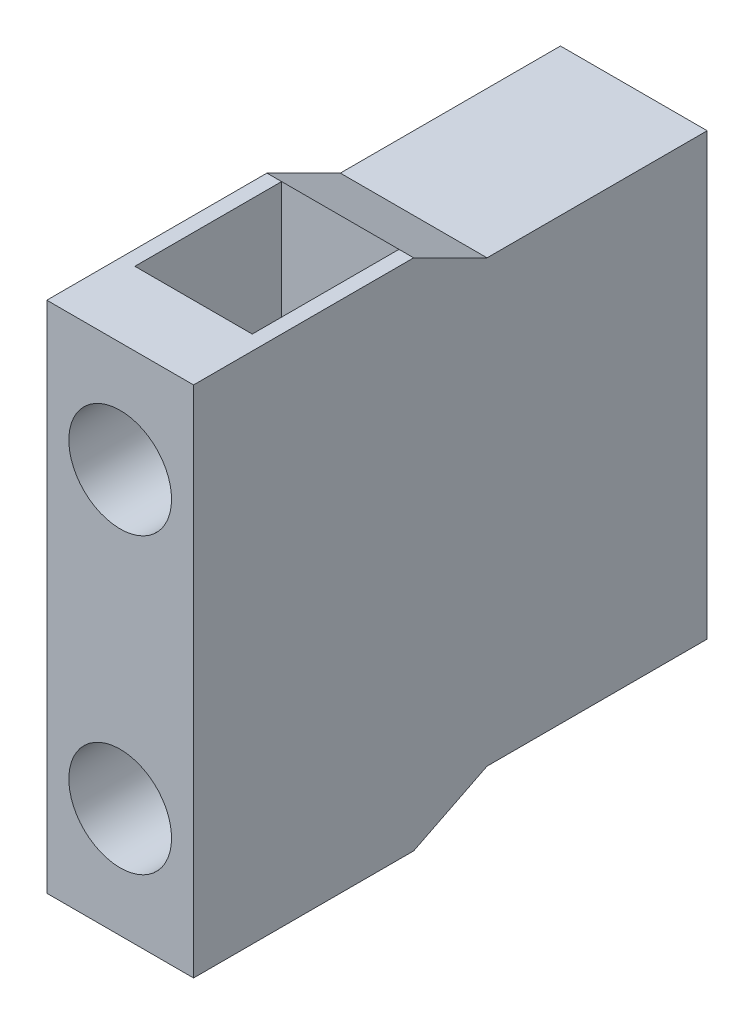
ISO-10303-21;
HEADER;
FILE_DESCRIPTION(('STEP AP214'),'2;1');
FILE_NAME('part.step','',(''),(''),'','','');
FILE_SCHEMA(('AUTOMOTIVE_DESIGN { 1 0 10303 214 1 1 1 1 }'));
ENDSEC;
DATA;
#1=APPLICATION_CONTEXT('core data for automotive mechanical design processes');
#2=APPLICATION_PROTOCOL_DEFINITION('international standard','automotive_design',2000,#1);
#3=PRODUCT_CONTEXT('',#1,'mechanical');
#4=PRODUCT('Part','Part','',(#3));
#5=PRODUCT_RELATED_PRODUCT_CATEGORY('part','',(#4));
#6=PRODUCT_DEFINITION_FORMATION('','',#4);
#7=PRODUCT_DEFINITION_CONTEXT('part definition',#1,'design');
#8=PRODUCT_DEFINITION('design','',#6,#7);
#9=PRODUCT_DEFINITION_SHAPE('','',#8);
#10=(LENGTH_UNIT() NAMED_UNIT(*) SI_UNIT(.MILLI.,.METRE.));
#11=(NAMED_UNIT(*) PLANE_ANGLE_UNIT() SI_UNIT($,.RADIAN.));
#12=(NAMED_UNIT(*) SI_UNIT($,.STERADIAN.) SOLID_ANGLE_UNIT());
#13=UNCERTAINTY_MEASURE_WITH_UNIT(LENGTH_MEASURE(1.E-05),#10,'distance_accuracy_value','');
#14=(GEOMETRIC_REPRESENTATION_CONTEXT(3) GLOBAL_UNCERTAINTY_ASSIGNED_CONTEXT((#13)) GLOBAL_UNIT_ASSIGNED_CONTEXT((#10,
#11,#12)) REPRESENTATION_CONTEXT('',''));
#15=CARTESIAN_POINT('',(0.,0.,0.));
#16=DIRECTION('',(0.,0.,1.));
#17=DIRECTION('',(1.,0.,0.));
#18=AXIS2_PLACEMENT_3D('',#15,#16,#17);
#19=CARTESIAN_POINT('',(9.,0.,-5.));
#20=DIRECTION('',(0.,0.,1.));
#21=DIRECTION('',(1.,0.,0.));
#22=AXIS2_PLACEMENT_3D('',#19,#20,#21);
#23=PLANE('',#22);
#24=CARTESIAN_POINT('',(5.,27.5,-5.));
#25=DIRECTION('',(0.,0.,1.));
#26=DIRECTION('',(1.,0.,0.));
#27=AXIS2_PLACEMENT_3D('',#24,#25,#26);
#28=CIRCLE('',#27,3.5);
#29=CARTESIAN_POINT('',(8.5,27.5,-5.));
#30=VERTEX_POINT('',#29);
#31=EDGE_CURVE('E178',#30,#30,#28,.F.);
#32=ORIENTED_EDGE('',*,*,#31,.F.);
#33=EDGE_LOOP('',(#32));
#34=FACE_BOUND('',#33,.T.);
#35=DIRECTION('',(0.,1.,0.));
#36=VECTOR('',#35,1.);
#37=CARTESIAN_POINT('',(9.,0.,-5.));
#38=LINE('',#37,#36);
#39=CARTESIAN_POINT('',(9.,20.,-5.));
#40=VERTEX_POINT('',#39);
#41=CARTESIAN_POINT('',(9.,35.,-5.));
#42=VERTEX_POINT('',#41);
#43=EDGE_CURVE('E252',#40,#42,#38,.T.);
#44=ORIENTED_EDGE('',*,*,#43,.F.);
#45=DIRECTION('',(-1.,0.,0.));
#46=VECTOR('',#45,1.);
#47=CARTESIAN_POINT('',(9.,20.,-5.));
#48=LINE('',#47,#46);
#49=CARTESIAN_POINT('',(1.,20.,-5.));
#50=VERTEX_POINT('',#49);
#51=EDGE_CURVE('E50',#40,#50,#48,.T.);
#52=ORIENTED_EDGE('',*,*,#51,.T.);
#53=DIRECTION('',(0.,1.,0.));
#54=VECTOR('',#53,1.);
#55=CARTESIAN_POINT('',(1.,0.,-5.));
#56=LINE('',#55,#54);
#57=CARTESIAN_POINT('',(0.999999999999999,35.,-5.));
#58=VERTEX_POINT('',#57);
#59=EDGE_CURVE('E253',#50,#58,#56,.T.);
#60=ORIENTED_EDGE('',*,*,#59,.T.);
#61=DIRECTION('',(1.,0.,0.));
#62=VECTOR('',#61,1.);
#63=CARTESIAN_POINT('',(9.,35.,-5.));
#64=LINE('',#63,#62);
#65=EDGE_CURVE('E263',#58,#42,#64,.T.);
#66=ORIENTED_EDGE('',*,*,#65,.T.);
#67=EDGE_LOOP('',(#44,#52,#60,#66));
#68=FACE_BOUND('',#67,.T.);
#69=ADVANCED_FACE('F35',(#34,#68),#23,.F.);
#70=CARTESIAN_POINT('',(1.,0.,-5.));
#71=DIRECTION('',(-1.,0.,0.));
#72=DIRECTION('',(0.,0.,1.));
#73=AXIS2_PLACEMENT_3D('',#70,#71,#72);
#74=PLANE('',#73);
#75=ORIENTED_EDGE('',*,*,#59,.F.);
#76=DIRECTION('',(0.,0.,-1.));
#77=VECTOR('',#76,1.);
#78=CARTESIAN_POINT('',(1.,20.,-5.));
#79=LINE('',#78,#77);
#80=CARTESIAN_POINT('',(0.999999999999999,20.,-15.));
#81=VERTEX_POINT('',#80);
#82=EDGE_CURVE('E278',#50,#81,#79,.T.);
#83=ORIENTED_EDGE('',*,*,#82,.T.);
#84=DIRECTION('',(0.,1.,0.));
#85=VECTOR('',#84,1.);
#86=CARTESIAN_POINT('',(0.999999999999999,0.,-15.));
#87=LINE('',#86,#85);
#88=CARTESIAN_POINT('',(0.999999999999999,35.,-15.));
#89=VERTEX_POINT('',#88);
#90=EDGE_CURVE('E159',#81,#89,#87,.T.);
#91=ORIENTED_EDGE('',*,*,#90,.T.);
#92=DIRECTION('',(0.,0.,1.));
#93=VECTOR('',#92,1.);
#94=CARTESIAN_POINT('',(1.,35.,-5.));
#95=LINE('',#94,#93);
#96=EDGE_CURVE('E266',#89,#58,#95,.T.);
#97=ORIENTED_EDGE('',*,*,#96,.T.);
#98=EDGE_LOOP('',(#75,#83,#91,#97));
#99=FACE_BOUND('',#98,.T.);
#100=ADVANCED_FACE('F340',(#99),#74,.F.);
#101=CARTESIAN_POINT('',(9.,0.,-5.));
#102=DIRECTION('',(1.,0.,0.));
#103=DIRECTION('',(0.,0.,-1.));
#104=AXIS2_PLACEMENT_3D('',#101,#102,#103);
#105=PLANE('',#104);
#106=DIRECTION('',(0.,1.,0.));
#107=VECTOR('',#106,1.);
#108=CARTESIAN_POINT('',(9.,0.,-15.));
#109=LINE('',#108,#107);
#110=CARTESIAN_POINT('',(9.,20.,-15.));
#111=VERTEX_POINT('',#110);
#112=CARTESIAN_POINT('',(9.,35.,-15.));
#113=VERTEX_POINT('',#112);
#114=EDGE_CURVE('E160',#111,#113,#109,.T.);
#115=ORIENTED_EDGE('',*,*,#114,.F.);
#116=DIRECTION('',(0.,0.,1.));
#117=VECTOR('',#116,1.);
#118=CARTESIAN_POINT('',(9.,20.,-5.));
#119=LINE('',#118,#117);
#120=EDGE_CURVE('E281',#111,#40,#119,.T.);
#121=ORIENTED_EDGE('',*,*,#120,.T.);
#122=ORIENTED_EDGE('',*,*,#43,.T.);
#123=DIRECTION('',(0.,0.,-1.));
#124=VECTOR('',#123,1.);
#125=CARTESIAN_POINT('',(9.,35.,-5.));
#126=LINE('',#125,#124);
#127=EDGE_CURVE('E260',#42,#113,#126,.T.);
#128=ORIENTED_EDGE('',*,*,#127,.T.);
#129=EDGE_LOOP('',(#115,#121,#122,#128));
#130=FACE_BOUND('',#129,.T.);
#131=ADVANCED_FACE('F336',(#130),#105,.F.);
#132=CARTESIAN_POINT('',(5.,27.5,-15.));
#133=DIRECTION('',(0.,0.,1.));
#134=DIRECTION('',(1.,0.,0.));
#135=AXIS2_PLACEMENT_3D('',#132,#133,#134);
#136=PLANE('',#135);
#137=DIRECTION('',(-1.,0.,0.));
#138=VECTOR('',#137,1.);
#139=CARTESIAN_POINT('',(5.,20.,-15.));
#140=LINE('',#139,#138);
#141=EDGE_CURVE('E11',#111,#81,#140,.T.);
#142=ORIENTED_EDGE('',*,*,#141,.F.);
#143=ORIENTED_EDGE('',*,*,#114,.T.);
#144=DIRECTION('',(-1.,0.,0.));
#145=VECTOR('',#144,1.);
#146=CARTESIAN_POINT('',(9.,35.,-15.));
#147=LINE('',#146,#145);
#148=EDGE_CURVE('E256',#113,#89,#147,.T.);
#149=ORIENTED_EDGE('',*,*,#148,.T.);
#150=ORIENTED_EDGE('',*,*,#90,.F.);
#151=EDGE_LOOP('',(#142,#143,#149,#150));
#152=FACE_BOUND('',#151,.T.);
#153=ADVANCED_FACE('F342',(#152),#136,.T.);
#154=CARTESIAN_POINT('',(10.,2.5,0.));
#155=DIRECTION('',(0.,1.,0.));
#156=DIRECTION('',(0.,0.,1.));
#157=AXIS2_PLACEMENT_3D('',#154,#155,#156);
#158=PLANE('',#157);
#159=DIRECTION('',(0.,0.,-1.));
#160=VECTOR('',#159,1.);
#161=CARTESIAN_POINT('',(0.,2.5,0.));
#162=LINE('',#161,#160);
#163=CARTESIAN_POINT('',(0.,2.5,-20.));
#164=VERTEX_POINT('',#163);
#165=CARTESIAN_POINT('',(0.,2.5,-35.));
#166=VERTEX_POINT('',#165);
#167=EDGE_CURVE('E221',#164,#166,#162,.T.);
#168=ORIENTED_EDGE('',*,*,#167,.T.);
#169=DIRECTION('',(-1.,0.,0.));
#170=VECTOR('',#169,1.);
#171=CARTESIAN_POINT('',(10.,2.5,-35.));
#172=LINE('',#171,#170);
#173=CARTESIAN_POINT('',(10.,2.5,-35.));
#174=VERTEX_POINT('',#173);
#175=EDGE_CURVE('E171',#174,#166,#172,.T.);
#176=ORIENTED_EDGE('',*,*,#175,.F.);
#177=DIRECTION('',(0.,0.,-1.));
#178=VECTOR('',#177,1.);
#179=CARTESIAN_POINT('',(10.,2.5,0.));
#180=LINE('',#179,#178);
#181=CARTESIAN_POINT('',(10.,2.5,-20.));
#182=VERTEX_POINT('',#181);
#183=EDGE_CURVE('E204',#182,#174,#180,.T.);
#184=ORIENTED_EDGE('',*,*,#183,.F.);
#185=DIRECTION('',(-1.,0.,0.));
#186=VECTOR('',#185,1.);
#187=CARTESIAN_POINT('',(10.,2.5,-20.));
#188=LINE('',#187,#186);
#189=EDGE_CURVE('E198',#182,#164,#188,.T.);
#190=ORIENTED_EDGE('',*,*,#189,.T.);
#191=EDGE_LOOP('',(#168,#176,#184,#190));
#192=FACE_BOUND('',#191,.T.);
#193=ADVANCED_FACE('F37',(#192),#158,.F.);
#194=CARTESIAN_POINT('',(10.,0.,-35.));
#195=DIRECTION('',(0.,0.,1.));
#196=DIRECTION('',(0.,-1.,0.));
#197=AXIS2_PLACEMENT_3D('',#194,#195,#196);
#198=PLANE('',#197);
#199=DIRECTION('',(0.,1.,0.));
#200=VECTOR('',#199,1.);
#201=CARTESIAN_POINT('',(0.,0.,-35.));
#202=LINE('',#201,#200);
#203=CARTESIAN_POINT('',(0.,32.5,-35.));
#204=VERTEX_POINT('',#203);
#205=EDGE_CURVE('E219',#166,#204,#202,.T.);
#206=ORIENTED_EDGE('',*,*,#205,.T.);
#207=DIRECTION('',(-1.,0.,0.));
#208=VECTOR('',#207,1.);
#209=CARTESIAN_POINT('',(10.,32.5,-35.));
#210=LINE('',#209,#208);
#211=CARTESIAN_POINT('',(10.,32.5,-35.));
#212=VERTEX_POINT('',#211);
#213=EDGE_CURVE('E173',#212,#204,#210,.T.);
#214=ORIENTED_EDGE('',*,*,#213,.F.);
#215=DIRECTION('',(0.,1.,0.));
#216=VECTOR('',#215,1.);
#217=CARTESIAN_POINT('',(10.,0.,-35.));
#218=LINE('',#217,#216);
#219=EDGE_CURVE('E239',#174,#212,#218,.T.);
#220=ORIENTED_EDGE('',*,*,#219,.F.);
#221=ORIENTED_EDGE('',*,*,#175,.T.);
#222=EDGE_LOOP('',(#206,#214,#220,#221));
#223=FACE_BOUND('',#222,.T.);
#224=ADVANCED_FACE('F324',(#223),#198,.F.);
#225=CARTESIAN_POINT('',(10.,32.5,0.));
#226=DIRECTION('',(0.,1.,0.));
#227=DIRECTION('',(0.,0.,1.));
#228=AXIS2_PLACEMENT_3D('',#225,#226,#227);
#229=PLANE('',#228);
#230=DIRECTION('',(0.,0.,-1.));
#231=VECTOR('',#230,1.);
#232=CARTESIAN_POINT('',(0.,32.5,0.));
#233=LINE('',#232,#231);
#234=CARTESIAN_POINT('',(0.,32.5,-20.));
#235=VERTEX_POINT('',#234);
#236=EDGE_CURVE('E216',#235,#204,#233,.T.);
#237=ORIENTED_EDGE('',*,*,#236,.F.);
#238=DIRECTION('',(-1.,0.,0.));
#239=VECTOR('',#238,1.);
#240=CARTESIAN_POINT('',(10.,32.5,-20.));
#241=LINE('',#240,#239);
#242=CARTESIAN_POINT('',(10.,32.5,-20.));
#243=VERTEX_POINT('',#242);
#244=EDGE_CURVE('E183',#243,#235,#241,.T.);
#245=ORIENTED_EDGE('',*,*,#244,.F.);
#246=DIRECTION('',(0.,0.,-1.));
#247=VECTOR('',#246,1.);
#248=CARTESIAN_POINT('',(10.,32.5,0.));
#249=LINE('',#248,#247);
#250=EDGE_CURVE('E236',#243,#212,#249,.T.);
#251=ORIENTED_EDGE('',*,*,#250,.T.);
#252=ORIENTED_EDGE('',*,*,#213,.T.);
#253=EDGE_LOOP('',(#237,#245,#251,#252));
#254=FACE_BOUND('',#253,.T.);
#255=ADVANCED_FACE('F326',(#254),#229,.T.);
#256=CARTESIAN_POINT('',(10.,34.,-17.));
#257=DIRECTION('',(0.,-0.894427190999916,0.447213595499957));
#258=DIRECTION('',(0.,-0.447213595499957,-0.894427190999916));
#259=AXIS2_PLACEMENT_3D('',#256,#257,#258);
#260=PLANE('',#259);
#261=DIRECTION('',(0.,0.447213595499957,0.894427190999916));
#262=VECTOR('',#261,1.);
#263=CARTESIAN_POINT('',(0.,34.,-17.));
#264=LINE('',#263,#262);
#265=CARTESIAN_POINT('',(0.,35.,-15.));
#266=VERTEX_POINT('',#265);
#267=EDGE_CURVE('E213',#235,#266,#264,.T.);
#268=ORIENTED_EDGE('',*,*,#267,.T.);
#269=DIRECTION('',(-1.,0.,0.));
#270=VECTOR('',#269,1.);
#271=CARTESIAN_POINT('',(10.,35.,-15.));
#272=LINE('',#271,#270);
#273=EDGE_CURVE('E188',#89,#266,#272,.T.);
#274=ORIENTED_EDGE('',*,*,#273,.F.);
#275=ORIENTED_EDGE('',*,*,#148,.F.);
#276=CARTESIAN_POINT('',(10.,35.,-15.));
#277=VERTEX_POINT('',#276);
#278=EDGE_CURVE('E185',#277,#113,#272,.T.);
#279=ORIENTED_EDGE('',*,*,#278,.F.);
#280=DIRECTION('',(0.,0.447213595499957,0.894427190999916));
#281=VECTOR('',#280,1.);
#282=CARTESIAN_POINT('',(10.,34.,-17.));
#283=LINE('',#282,#281);
#284=EDGE_CURVE('E234',#243,#277,#283,.T.);
#285=ORIENTED_EDGE('',*,*,#284,.F.);
#286=ORIENTED_EDGE('',*,*,#244,.T.);
#287=EDGE_LOOP('',(#268,#274,#275,#279,#285,#286));
#288=FACE_BOUND('',#287,.T.);
#289=ADVANCED_FACE('F330',(#288),#260,.F.);
#290=CARTESIAN_POINT('',(10.,35.,0.));
#291=DIRECTION('',(0.,1.,0.));
#292=DIRECTION('',(0.,0.,1.));
#293=AXIS2_PLACEMENT_3D('',#290,#291,#292);
#294=PLANE('',#293);
#295=ORIENTED_EDGE('',*,*,#96,.F.);
#296=ORIENTED_EDGE('',*,*,#273,.T.);
#297=DIRECTION('',(0.,0.,-1.));
#298=VECTOR('',#297,1.);
#299=CARTESIAN_POINT('',(0.,35.,0.));
#300=LINE('',#299,#298);
#301=CARTESIAN_POINT('',(0.,35.,0.));
#302=VERTEX_POINT('',#301);
#303=EDGE_CURVE('E210',#302,#266,#300,.T.);
#304=ORIENTED_EDGE('',*,*,#303,.F.);
#305=DIRECTION('',(-1.,0.,0.));
#306=VECTOR('',#305,1.);
#307=CARTESIAN_POINT('',(10.,35.,0.));
#308=LINE('',#307,#306);
#309=CARTESIAN_POINT('',(10.,35.,0.));
#310=VERTEX_POINT('',#309);
#311=EDGE_CURVE('E189',#310,#302,#308,.T.);
#312=ORIENTED_EDGE('',*,*,#311,.F.);
#313=DIRECTION('',(0.,0.,-1.));
#314=VECTOR('',#313,1.);
#315=CARTESIAN_POINT('',(10.,35.,0.));
#316=LINE('',#315,#314);
#317=EDGE_CURVE('E231',#310,#277,#316,.T.);
#318=ORIENTED_EDGE('',*,*,#317,.T.);
#319=ORIENTED_EDGE('',*,*,#278,.T.);
#320=ORIENTED_EDGE('',*,*,#127,.F.);
#321=ORIENTED_EDGE('',*,*,#65,.F.);
#322=EDGE_LOOP('',(#295,#296,#304,#312,#318,#319,#320,#321));
#323=FACE_BOUND('',#322,.T.);
#324=ADVANCED_FACE('F311',(#323),#294,.T.);
#325=CARTESIAN_POINT('',(10.,0.,0.));
#326=DIRECTION('',(0.,0.,1.));
#327=DIRECTION('',(1.,0.,0.));
#328=AXIS2_PLACEMENT_3D('',#325,#326,#327);
#329=PLANE('',#328);
#330=DIRECTION('',(0.,1.,0.));
#331=VECTOR('',#330,1.);
#332=CARTESIAN_POINT('',(10.,0.,0.));
#333=LINE('',#332,#331);
#334=CARTESIAN_POINT('',(10.,0.,0.));
#335=VERTEX_POINT('',#334);
#336=EDGE_CURVE('E229',#335,#310,#333,.T.);
#337=ORIENTED_EDGE('',*,*,#336,.T.);
#338=ORIENTED_EDGE('',*,*,#311,.T.);
#339=DIRECTION('',(0.,1.,0.));
#340=VECTOR('',#339,1.);
#341=CARTESIAN_POINT('',(0.,0.,0.));
#342=LINE('',#341,#340);
#343=CARTESIAN_POINT('',(0.,0.,0.));
#344=VERTEX_POINT('',#343);
#345=EDGE_CURVE('E208',#344,#302,#342,.T.);
#346=ORIENTED_EDGE('',*,*,#345,.F.);
#347=DIRECTION('',(-1.,0.,0.));
#348=VECTOR('',#347,1.);
#349=CARTESIAN_POINT('',(10.,0.,0.));
#350=LINE('',#349,#348);
#351=EDGE_CURVE('E192',#335,#344,#350,.T.);
#352=ORIENTED_EDGE('',*,*,#351,.F.);
#353=EDGE_LOOP('',(#337,#338,#346,#352));
#354=FACE_BOUND('',#353,.T.);
#355=CARTESIAN_POINT('',(5.,7.49999999999999,0.));
#356=DIRECTION('',(0.,0.,1.));
#357=DIRECTION('',(1.,0.,0.));
#358=AXIS2_PLACEMENT_3D('',#355,#356,#357);
#359=CIRCLE('',#358,3.5);
#360=CARTESIAN_POINT('',(8.5,7.49999999999999,0.));
#361=VERTEX_POINT('',#360);
#362=EDGE_CURVE('E245',#361,#361,#359,.T.);
#363=ORIENTED_EDGE('',*,*,#362,.F.);
#364=EDGE_LOOP('',(#363));
#365=FACE_BOUND('',#364,.T.);
#366=CARTESIAN_POINT('',(5.,27.5,0.));
#367=DIRECTION('',(0.,0.,1.));
#368=DIRECTION('',(1.,0.,0.));
#369=AXIS2_PLACEMENT_3D('',#366,#367,#368);
#370=CIRCLE('',#369,3.5);
#371=CARTESIAN_POINT('',(8.5,27.5,0.));
#372=VERTEX_POINT('',#371);
#373=EDGE_CURVE('E224',#372,#372,#370,.T.);
#374=ORIENTED_EDGE('',*,*,#373,.F.);
#375=EDGE_LOOP('',(#374));
#376=FACE_BOUND('',#375,.T.);
#377=ADVANCED_FACE('F305',(#354,#365,#376),#329,.T.);
#378=CARTESIAN_POINT('',(10.,0.,0.));
#379=DIRECTION('',(0.,1.,0.));
#380=DIRECTION('',(0.,0.,1.));
#381=AXIS2_PLACEMENT_3D('',#378,#379,#380);
#382=PLANE('',#381);
#383=DIRECTION('',(-1.,0.,0.));
#384=VECTOR('',#383,1.);
#385=CARTESIAN_POINT('',(10.,0.,-15.));
#386=LINE('',#385,#384);
#387=CARTESIAN_POINT('',(0.999999999999999,0.,-15.));
#388=VERTEX_POINT('',#387);
#389=CARTESIAN_POINT('',(0.,0.,-15.));
#390=VERTEX_POINT('',#389);
#391=EDGE_CURVE('E197',#388,#390,#386,.T.);
#392=ORIENTED_EDGE('',*,*,#391,.F.);
#393=DIRECTION('',(0.,0.,1.));
#394=VECTOR('',#393,1.);
#395=CARTESIAN_POINT('',(1.,0.,-5.));
#396=LINE('',#395,#394);
#397=CARTESIAN_POINT('',(1.,0.,-5.));
#398=VERTEX_POINT('',#397);
#399=EDGE_CURVE('E259',#388,#398,#396,.T.);
#400=ORIENTED_EDGE('',*,*,#399,.T.);
#401=DIRECTION('',(1.,0.,0.));
#402=VECTOR('',#401,1.);
#403=CARTESIAN_POINT('',(9.,0.,-5.));
#404=LINE('',#403,#402);
#405=CARTESIAN_POINT('',(9.,0.,-5.));
#406=VERTEX_POINT('',#405);
#407=EDGE_CURVE('E272',#398,#406,#404,.T.);
#408=ORIENTED_EDGE('',*,*,#407,.T.);
#409=DIRECTION('',(0.,0.,-1.));
#410=VECTOR('',#409,1.);
#411=CARTESIAN_POINT('',(9.,0.,-5.));
#412=LINE('',#411,#410);
#413=CARTESIAN_POINT('',(9.,0.,-15.));
#414=VERTEX_POINT('',#413);
#415=EDGE_CURVE('E270',#406,#414,#412,.T.);
#416=ORIENTED_EDGE('',*,*,#415,.T.);
#417=CARTESIAN_POINT('',(10.,0.,-15.));
#418=VERTEX_POINT('',#417);
#419=EDGE_CURVE('E194',#418,#414,#386,.T.);
#420=ORIENTED_EDGE('',*,*,#419,.F.);
#421=DIRECTION('',(0.,0.,-1.));
#422=VECTOR('',#421,1.);
#423=CARTESIAN_POINT('',(10.,0.,0.));
#424=LINE('',#423,#422);
#425=EDGE_CURVE('E227',#335,#418,#424,.T.);
#426=ORIENTED_EDGE('',*,*,#425,.F.);
#427=ORIENTED_EDGE('',*,*,#351,.T.);
#428=DIRECTION('',(0.,0.,-1.));
#429=VECTOR('',#428,1.);
#430=CARTESIAN_POINT('',(0.,0.,0.));
#431=LINE('',#430,#429);
#432=EDGE_CURVE('E205',#344,#390,#431,.T.);
#433=ORIENTED_EDGE('',*,*,#432,.T.);
#434=EDGE_LOOP('',(#392,#400,#408,#416,#420,#426,#427,#433));
#435=FACE_BOUND('',#434,.T.);
#436=ADVANCED_FACE('F291',(#435),#382,.F.);
#437=CARTESIAN_POINT('',(10.,-6.,-3.));
#438=DIRECTION('',(0.,-0.894427190999916,-0.447213595499958));
#439=DIRECTION('',(0.,0.447213595499958,-0.894427190999916));
#440=AXIS2_PLACEMENT_3D('',#437,#438,#439);
#441=PLANE('',#440);
#442=DIRECTION('',(0.,-0.447213595499958,0.894427190999916));
#443=VECTOR('',#442,1.);
#444=CARTESIAN_POINT('',(0.,-6.,-3.));
#445=LINE('',#444,#443);
#446=EDGE_CURVE('E201',#164,#390,#445,.T.);
#447=ORIENTED_EDGE('',*,*,#446,.F.);
#448=ORIENTED_EDGE('',*,*,#189,.F.);
#449=DIRECTION('',(0.,-0.447213595499958,0.894427190999916));
#450=VECTOR('',#449,1.);
#451=CARTESIAN_POINT('',(10.,-6.,-3.));
#452=LINE('',#451,#450);
#453=EDGE_CURVE('E200',#182,#418,#452,.T.);
#454=ORIENTED_EDGE('',*,*,#453,.T.);
#455=ORIENTED_EDGE('',*,*,#419,.T.);
#456=DIRECTION('',(-1.,0.,0.));
#457=VECTOR('',#456,1.);
#458=CARTESIAN_POINT('',(9.,0.,-15.));
#459=LINE('',#458,#457);
#460=EDGE_CURVE('E155',#414,#388,#459,.T.);
#461=ORIENTED_EDGE('',*,*,#460,.T.);
#462=ORIENTED_EDGE('',*,*,#391,.T.);
#463=EDGE_LOOP('',(#447,#448,#454,#455,#461,#462));
#464=FACE_BOUND('',#463,.T.);
#465=ADVANCED_FACE('F295',(#464),#441,.T.);
#466=CARTESIAN_POINT('',(10.,0.,0.));
#467=DIRECTION('',(1.,0.,0.));
#468=DIRECTION('',(0.,0.,-1.));
#469=AXIS2_PLACEMENT_3D('',#466,#467,#468);
#470=PLANE('',#469);
#471=ORIENTED_EDGE('',*,*,#219,.T.);
#472=ORIENTED_EDGE('',*,*,#250,.F.);
#473=ORIENTED_EDGE('',*,*,#284,.T.);
#474=ORIENTED_EDGE('',*,*,#317,.F.);
#475=ORIENTED_EDGE('',*,*,#336,.F.);
#476=ORIENTED_EDGE('',*,*,#425,.T.);
#477=ORIENTED_EDGE('',*,*,#453,.F.);
#478=ORIENTED_EDGE('',*,*,#183,.T.);
#479=EDGE_LOOP('',(#471,#472,#473,#474,#475,#476,#477,#478));
#480=FACE_BOUND('',#479,.T.);
#481=ADVANCED_FACE('F302',(#480),#470,.T.);
#482=CARTESIAN_POINT('',(0.,0.,0.));
#483=DIRECTION('',(1.,0.,0.));
#484=DIRECTION('',(0.,0.,-1.));
#485=AXIS2_PLACEMENT_3D('',#482,#483,#484);
#486=PLANE('',#485);
#487=ORIENTED_EDGE('',*,*,#345,.T.);
#488=ORIENTED_EDGE('',*,*,#303,.T.);
#489=ORIENTED_EDGE('',*,*,#267,.F.);
#490=ORIENTED_EDGE('',*,*,#236,.T.);
#491=ORIENTED_EDGE('',*,*,#205,.F.);
#492=ORIENTED_EDGE('',*,*,#167,.F.);
#493=ORIENTED_EDGE('',*,*,#446,.T.);
#494=ORIENTED_EDGE('',*,*,#432,.F.);
#495=EDGE_LOOP('',(#487,#488,#489,#490,#491,#492,#493,#494));
#496=FACE_BOUND('',#495,.T.);
#497=ADVANCED_FACE('F315',(#496),#486,.F.);
#498=CARTESIAN_POINT('',(5.,27.5,-15.));
#499=DIRECTION('',(0.,0.,1.));
#500=DIRECTION('',(1.,0.,0.));
#501=AXIS2_PLACEMENT_3D('',#498,#499,#500);
#502=CYLINDRICAL_SURFACE('',#501,3.5);
#503=ORIENTED_EDGE('',*,*,#31,.T.);
#504=EDGE_LOOP('',(#503));
#505=FACE_BOUND('',#504,.T.);
#506=ORIENTED_EDGE('',*,*,#373,.T.);
#507=EDGE_LOOP('',(#506));
#508=FACE_BOUND('',#507,.T.);
#509=ADVANCED_FACE('F367',(#505,#508),#502,.F.);
#510=CARTESIAN_POINT('',(5.,7.49999999999999,-15.));
#511=DIRECTION('',(0.,0.,1.));
#512=DIRECTION('',(1.,0.,0.));
#513=AXIS2_PLACEMENT_3D('',#510,#511,#512);
#514=CYLINDRICAL_SURFACE('',#513,3.5);
#515=CARTESIAN_POINT('',(5.,7.49999999999999,-5.));
#516=DIRECTION('',(0.,0.,1.));
#517=DIRECTION('',(1.,0.,0.));
#518=AXIS2_PLACEMENT_3D('',#515,#516,#517);
#519=CIRCLE('',#518,3.5);
#520=CARTESIAN_POINT('',(8.5,7.49999999999999,-5.));
#521=VERTEX_POINT('',#520);
#522=EDGE_CURVE('E176',#521,#521,#519,.F.);
#523=ORIENTED_EDGE('',*,*,#522,.T.);
#524=EDGE_LOOP('',(#523));
#525=FACE_BOUND('',#524,.T.);
#526=ORIENTED_EDGE('',*,*,#362,.T.);
#527=EDGE_LOOP('',(#526));
#528=FACE_BOUND('',#527,.T.);
#529=ADVANCED_FACE('F361',(#525,#528),#514,.F.);
#530=ORIENTED_EDGE('',*,*,#522,.F.);
#531=EDGE_LOOP('',(#530));
#532=FACE_BOUND('',#531,.T.);
#533=CARTESIAN_POINT('',(1.,15.,-5.));
#534=VERTEX_POINT('',#533);
#535=EDGE_CURVE('E250',#398,#534,#56,.T.);
#536=ORIENTED_EDGE('',*,*,#535,.T.);
#537=DIRECTION('',(1.,0.,0.));
#538=VECTOR('',#537,1.);
#539=CARTESIAN_POINT('',(9.,15.,-5.));
#540=LINE('',#539,#538);
#541=CARTESIAN_POINT('',(9.,15.,-5.));
#542=VERTEX_POINT('',#541);
#543=EDGE_CURVE('E283',#534,#542,#540,.T.);
#544=ORIENTED_EDGE('',*,*,#543,.T.);
#545=EDGE_CURVE('E166',#406,#542,#38,.T.);
#546=ORIENTED_EDGE('',*,*,#545,.F.);
#547=ORIENTED_EDGE('',*,*,#407,.F.);
#548=EDGE_LOOP('',(#536,#544,#546,#547));
#549=FACE_BOUND('',#548,.T.);
#550=ADVANCED_FACE('F286',(#532,#549),#23,.F.);
#551=CARTESIAN_POINT('',(0.999999999999999,15.,-15.));
#552=VERTEX_POINT('',#551);
#553=EDGE_CURVE('E179',#388,#552,#87,.T.);
#554=ORIENTED_EDGE('',*,*,#553,.T.);
#555=DIRECTION('',(0.,0.,1.));
#556=VECTOR('',#555,1.);
#557=CARTESIAN_POINT('',(1.,15.,-5.));
#558=LINE('',#557,#556);
#559=EDGE_CURVE('E58',#552,#534,#558,.T.);
#560=ORIENTED_EDGE('',*,*,#559,.T.);
#561=ORIENTED_EDGE('',*,*,#535,.F.);
#562=ORIENTED_EDGE('',*,*,#399,.F.);
#563=EDGE_LOOP('',(#554,#560,#561,#562));
#564=FACE_BOUND('',#563,.T.);
#565=ADVANCED_FACE('F288',(#564),#74,.F.);
#566=ORIENTED_EDGE('',*,*,#545,.T.);
#567=DIRECTION('',(0.,0.,-1.));
#568=VECTOR('',#567,1.);
#569=CARTESIAN_POINT('',(9.,15.,-5.));
#570=LINE('',#569,#568);
#571=CARTESIAN_POINT('',(9.,15.,-15.));
#572=VERTEX_POINT('',#571);
#573=EDGE_CURVE('E164',#542,#572,#570,.T.);
#574=ORIENTED_EDGE('',*,*,#573,.T.);
#575=EDGE_CURVE('E149',#414,#572,#109,.T.);
#576=ORIENTED_EDGE('',*,*,#575,.F.);
#577=ORIENTED_EDGE('',*,*,#415,.F.);
#578=EDGE_LOOP('',(#566,#574,#576,#577));
#579=FACE_BOUND('',#578,.T.);
#580=ADVANCED_FACE('F165',(#579),#105,.F.);
#581=DIRECTION('',(1.,0.,0.));
#582=VECTOR('',#581,1.);
#583=CARTESIAN_POINT('',(5.,15.,-15.));
#584=LINE('',#583,#582);
#585=EDGE_CURVE('E43',#552,#572,#584,.T.);
#586=ORIENTED_EDGE('',*,*,#585,.F.);
#587=ORIENTED_EDGE('',*,*,#553,.F.);
#588=ORIENTED_EDGE('',*,*,#460,.F.);
#589=ORIENTED_EDGE('',*,*,#575,.T.);
#590=EDGE_LOOP('',(#586,#587,#588,#589));
#591=FACE_BOUND('',#590,.T.);
#592=ADVANCED_FACE('F151',(#591),#136,.T.);
#593=CARTESIAN_POINT('',(0.,15.,-35.));
#594=DIRECTION('',(0.,-1.,0.));
#595=DIRECTION('',(0.,0.,-1.));
#596=AXIS2_PLACEMENT_3D('',#593,#594,#595);
#597=PLANE('',#596);
#598=ORIENTED_EDGE('',*,*,#543,.F.);
#599=ORIENTED_EDGE('',*,*,#559,.F.);
#600=ORIENTED_EDGE('',*,*,#585,.T.);
#601=ORIENTED_EDGE('',*,*,#573,.F.);
#602=EDGE_LOOP('',(#598,#599,#600,#601));
#603=FACE_BOUND('',#602,.T.);
#604=ADVANCED_FACE('F170',(#603),#597,.T.);
#605=CARTESIAN_POINT('',(0.,20.,-35.));
#606=DIRECTION('',(0.,1.,0.));
#607=DIRECTION('',(0.,0.,1.));
#608=AXIS2_PLACEMENT_3D('',#605,#606,#607);
#609=PLANE('',#608);
#610=ORIENTED_EDGE('',*,*,#51,.F.);
#611=ORIENTED_EDGE('',*,*,#120,.F.);
#612=ORIENTED_EDGE('',*,*,#141,.T.);
#613=ORIENTED_EDGE('',*,*,#82,.F.);
#614=EDGE_LOOP('',(#610,#611,#612,#613));
#615=FACE_BOUND('',#614,.T.);
#616=ADVANCED_FACE('F344',(#615),#609,.T.);
#617=CLOSED_SHELL('',(#69,#100,#131,#153,#193,#224,#255,#289,#324,#377,#436,#465,#481,#497,#509,
#529,#550,#565,#580,#592,#604,#616));
#618=MANIFOLD_SOLID_BREP('B2',#617);
#619=ADVANCED_BREP_SHAPE_REPRESENTATION('',(#18,#618),#14);
#620=SHAPE_DEFINITION_REPRESENTATION(#9,#619);
ENDSEC;
END-ISO-10303-21;
